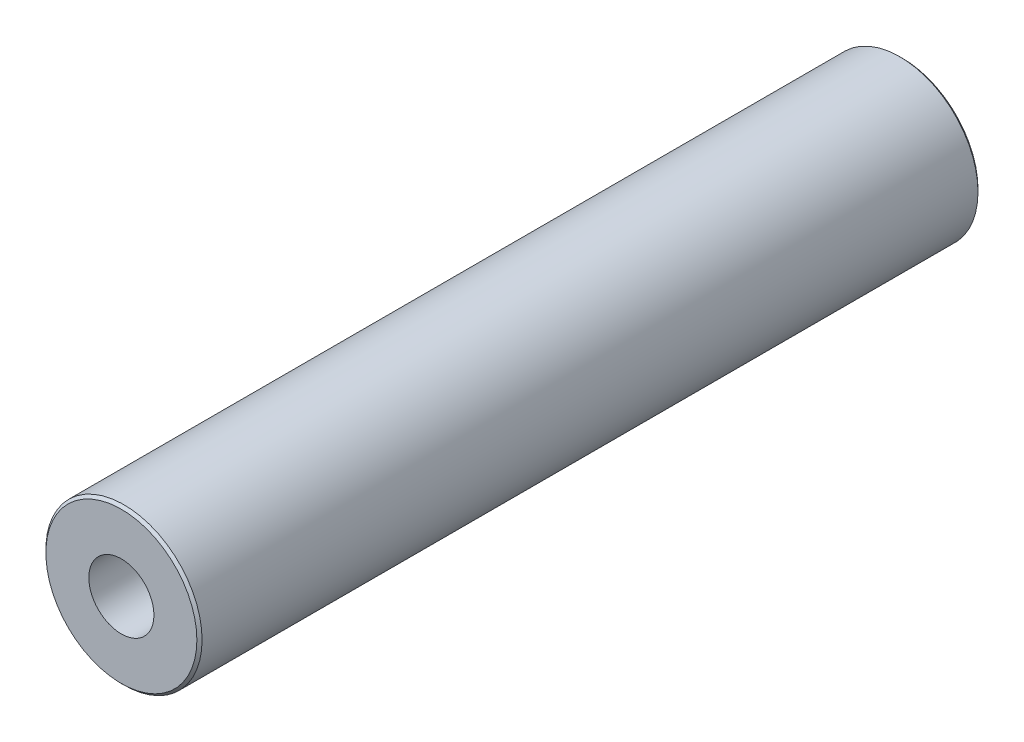
ISO-10303-21;
HEADER;
FILE_DESCRIPTION(('STEP AP214'),'2;1');
FILE_NAME('part.step','',(''),(''),'','','');
FILE_SCHEMA(('AUTOMOTIVE_DESIGN { 1 0 10303 214 1 1 1 1 }'));
ENDSEC;
DATA;
#1=APPLICATION_CONTEXT('core data for automotive mechanical design processes');
#2=APPLICATION_PROTOCOL_DEFINITION('international standard','automotive_design',2000,#1);
#3=PRODUCT_CONTEXT('',#1,'mechanical');
#4=PRODUCT('Part','Part','',(#3));
#5=PRODUCT_RELATED_PRODUCT_CATEGORY('part','',(#4));
#6=PRODUCT_DEFINITION_FORMATION('','',#4);
#7=PRODUCT_DEFINITION_CONTEXT('part definition',#1,'design');
#8=PRODUCT_DEFINITION('design','',#6,#7);
#9=PRODUCT_DEFINITION_SHAPE('','',#8);
#10=(LENGTH_UNIT() NAMED_UNIT(*) SI_UNIT(.MILLI.,.METRE.));
#11=(NAMED_UNIT(*) PLANE_ANGLE_UNIT() SI_UNIT($,.RADIAN.));
#12=(NAMED_UNIT(*) SI_UNIT($,.STERADIAN.) SOLID_ANGLE_UNIT());
#13=UNCERTAINTY_MEASURE_WITH_UNIT(LENGTH_MEASURE(1.E-05),#10,'distance_accuracy_value','');
#14=(GEOMETRIC_REPRESENTATION_CONTEXT(3) GLOBAL_UNCERTAINTY_ASSIGNED_CONTEXT((#13)) GLOBAL_UNIT_ASSIGNED_CONTEXT((#10,
#11,#12)) REPRESENTATION_CONTEXT('',''));
#15=CARTESIAN_POINT('',(0.,0.,0.));
#16=DIRECTION('',(0.,0.,1.));
#17=DIRECTION('',(1.,0.,0.));
#18=AXIS2_PLACEMENT_3D('',#15,#16,#17);
#19=CARTESIAN_POINT('',(0.,0.,15.));
#20=DIRECTION('',(0.,0.,-1.));
#21=DIRECTION('',(-1.,0.,0.));
#22=AXIS2_PLACEMENT_3D('',#19,#20,#21);
#23=CYLINDRICAL_SURFACE('',#22,3.);
#24=CARTESIAN_POINT('',(0.,0.,-14.9));
#25=DIRECTION('',(0.,0.,1.));
#26=DIRECTION('',(1.,0.,0.));
#27=AXIS2_PLACEMENT_3D('',#24,#25,#26);
#28=CIRCLE('',#27,3.);
#29=CARTESIAN_POINT('',(3.,0.,-14.9));
#30=VERTEX_POINT('',#29);
#31=EDGE_CURVE('E52',#30,#30,#28,.T.);
#32=ORIENTED_EDGE('',*,*,#31,.T.);
#33=EDGE_LOOP('',(#32));
#34=FACE_BOUND('',#33,.T.);
#35=CARTESIAN_POINT('',(0.,0.,14.9));
#36=DIRECTION('',(0.,0.,1.));
#37=DIRECTION('',(1.,0.,0.));
#38=AXIS2_PLACEMENT_3D('',#35,#36,#37);
#39=CIRCLE('',#38,3.);
#40=CARTESIAN_POINT('',(3.,0.,14.9));
#41=VERTEX_POINT('',#40);
#42=EDGE_CURVE('E56',#41,#41,#39,.F.);
#43=ORIENTED_EDGE('',*,*,#42,.T.);
#44=EDGE_LOOP('',(#43));
#45=FACE_BOUND('',#44,.T.);
#46=ADVANCED_FACE('F40',(#34,#45),#23,.T.);
#47=CARTESIAN_POINT('',(0.,0.,15.));
#48=DIRECTION('',(0.,0.,1.));
#49=DIRECTION('',(1.,0.,0.));
#50=AXIS2_PLACEMENT_3D('',#47,#48,#49);
#51=PLANE('',#50);
#52=CARTESIAN_POINT('',(0.,0.,15.));
#53=DIRECTION('',(0.,0.,1.));
#54=DIRECTION('',(1.,0.,0.));
#55=AXIS2_PLACEMENT_3D('',#52,#53,#54);
#56=CIRCLE('',#55,1.25);
#57=CARTESIAN_POINT('',(1.25,0.,15.));
#58=VERTEX_POINT('',#57);
#59=EDGE_CURVE('E64',#58,#58,#56,.T.);
#60=ORIENTED_EDGE('',*,*,#59,.F.);
#61=EDGE_LOOP('',(#60));
#62=FACE_BOUND('',#61,.T.);
#63=CARTESIAN_POINT('',(0.,0.,15.));
#64=DIRECTION('',(0.,0.,1.));
#65=DIRECTION('',(1.,0.,0.));
#66=AXIS2_PLACEMENT_3D('',#63,#64,#65);
#67=CIRCLE('',#66,2.9);
#68=CARTESIAN_POINT('',(2.9,0.,15.));
#69=VERTEX_POINT('',#68);
#70=EDGE_CURVE('E10',#69,#69,#67,.T.);
#71=ORIENTED_EDGE('',*,*,#70,.T.);
#72=EDGE_LOOP('',(#71));
#73=FACE_BOUND('',#72,.T.);
#74=ADVANCED_FACE('F70',(#62,#73),#51,.T.);
#75=CARTESIAN_POINT('',(0.,0.,-15.));
#76=DIRECTION('',(0.,0.,1.));
#77=DIRECTION('',(1.,0.,0.));
#78=AXIS2_PLACEMENT_3D('',#75,#76,#77);
#79=PLANE('',#78);
#80=CARTESIAN_POINT('',(0.,0.,-15.));
#81=DIRECTION('',(0.,0.,1.));
#82=DIRECTION('',(1.,0.,0.));
#83=AXIS2_PLACEMENT_3D('',#80,#81,#82);
#84=CIRCLE('',#83,1.24999999999999);
#85=CARTESIAN_POINT('',(1.24999999999999,0.,-15.));
#86=VERTEX_POINT('',#85);
#87=EDGE_CURVE('E61',#86,#86,#84,.T.);
#88=ORIENTED_EDGE('',*,*,#87,.T.);
#89=EDGE_LOOP('',(#88));
#90=FACE_BOUND('',#89,.T.);
#91=CARTESIAN_POINT('',(0.,0.,-15.));
#92=DIRECTION('',(0.,0.,1.));
#93=DIRECTION('',(1.,0.,0.));
#94=AXIS2_PLACEMENT_3D('',#91,#92,#93);
#95=CIRCLE('',#94,2.9);
#96=CARTESIAN_POINT('',(2.9,0.,-15.));
#97=VERTEX_POINT('',#96);
#98=EDGE_CURVE('E48',#97,#97,#95,.F.);
#99=ORIENTED_EDGE('',*,*,#98,.T.);
#100=EDGE_LOOP('',(#99));
#101=FACE_BOUND('',#100,.T.);
#102=ADVANCED_FACE('F72',(#90,#101),#79,.F.);
#103=CARTESIAN_POINT('',(0.,0.,-14.9));
#104=DIRECTION('',(0.,0.,1.));
#105=DIRECTION('',(1.,0.,0.));
#106=AXIS2_PLACEMENT_3D('',#103,#104,#105);
#107=CONICAL_SURFACE('',#106,3.,0.785398163397455);
#108=ORIENTED_EDGE('',*,*,#98,.F.);
#109=EDGE_LOOP('',(#108));
#110=FACE_BOUND('',#109,.T.);
#111=ORIENTED_EDGE('',*,*,#31,.F.);
#112=EDGE_LOOP('',(#111));
#113=FACE_BOUND('',#112,.T.);
#114=ADVANCED_FACE('F78',(#110,#113),#107,.T.);
#115=CARTESIAN_POINT('',(0.,0.,15.));
#116=DIRECTION('',(0.,0.,-1.));
#117=DIRECTION('',(-1.,0.,0.));
#118=AXIS2_PLACEMENT_3D('',#115,#116,#117);
#119=CONICAL_SURFACE('',#118,2.9,0.78539816339744);
#120=ORIENTED_EDGE('',*,*,#42,.F.);
#121=EDGE_LOOP('',(#120));
#122=FACE_BOUND('',#121,.T.);
#123=ORIENTED_EDGE('',*,*,#70,.F.);
#124=EDGE_LOOP('',(#123));
#125=FACE_BOUND('',#124,.T.);
#126=ADVANCED_FACE('F43',(#122,#125),#119,.T.);
#127=CARTESIAN_POINT('',(0.,0.,15.));
#128=DIRECTION('',(0.,0.,1.));
#129=DIRECTION('',(1.,0.,0.));
#130=AXIS2_PLACEMENT_3D('',#127,#128,#129);
#131=CYLINDRICAL_SURFACE('',#130,1.25);
#132=ORIENTED_EDGE('',*,*,#87,.F.);
#133=EDGE_LOOP('',(#132));
#134=FACE_BOUND('',#133,.T.);
#135=ORIENTED_EDGE('',*,*,#59,.T.);
#136=EDGE_LOOP('',(#135));
#137=FACE_BOUND('',#136,.T.);
#138=ADVANCED_FACE('F68',(#134,#137),#131,.F.);
#139=CLOSED_SHELL('',(#46,#74,#102,#114,#126,#138));
#140=MANIFOLD_SOLID_BREP('B2',#139);
#141=ADVANCED_BREP_SHAPE_REPRESENTATION('',(#18,#140),#14);
#142=SHAPE_DEFINITION_REPRESENTATION(#9,#141);
ENDSEC;
END-ISO-10303-21;
